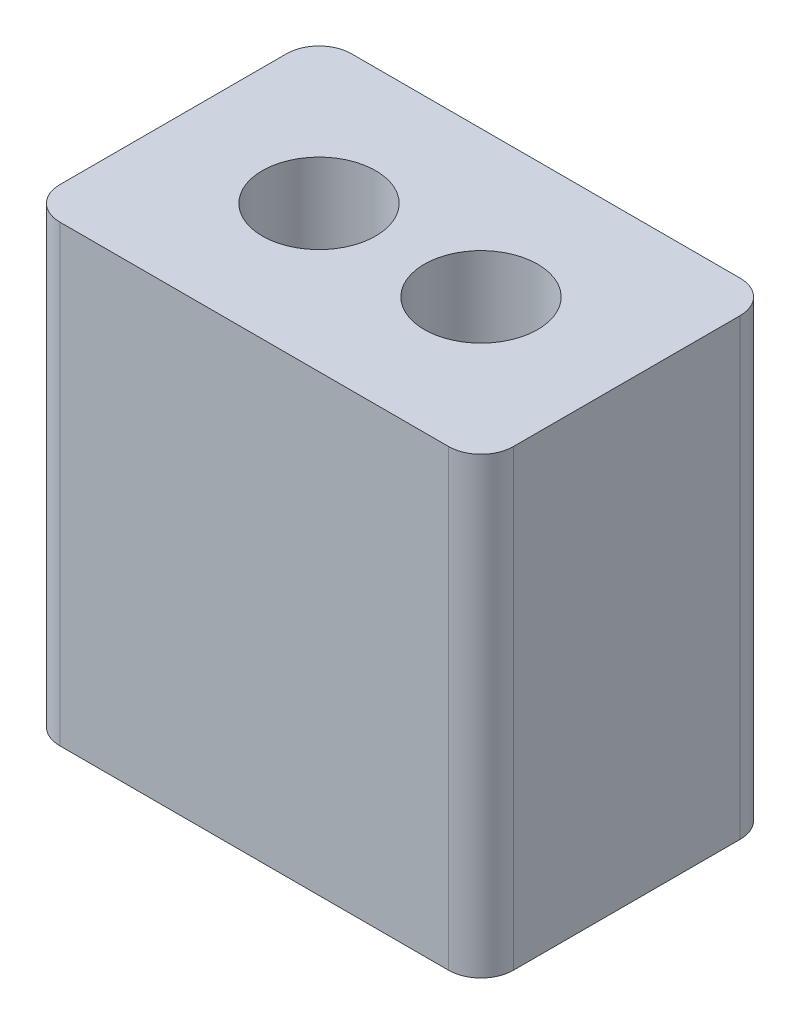
ISO-10303-21;
HEADER;
FILE_DESCRIPTION(('STEP AP214'),'2;1');
FILE_NAME('part.step','',(''),(''),'','','');
FILE_SCHEMA(('AUTOMOTIVE_DESIGN { 1 0 10303 214 1 1 1 1 }'));
ENDSEC;
DATA;
#1=APPLICATION_CONTEXT('core data for automotive mechanical design processes');
#2=APPLICATION_PROTOCOL_DEFINITION('international standard','automotive_design',2000,#1);
#3=PRODUCT_CONTEXT('',#1,'mechanical');
#4=PRODUCT('Part','Part','',(#3));
#5=PRODUCT_RELATED_PRODUCT_CATEGORY('part','',(#4));
#6=PRODUCT_DEFINITION_FORMATION('','',#4);
#7=PRODUCT_DEFINITION_CONTEXT('part definition',#1,'design');
#8=PRODUCT_DEFINITION('design','',#6,#7);
#9=PRODUCT_DEFINITION_SHAPE('','',#8);
#10=(LENGTH_UNIT() NAMED_UNIT(*) SI_UNIT(.MILLI.,.METRE.));
#11=(NAMED_UNIT(*) PLANE_ANGLE_UNIT() SI_UNIT($,.RADIAN.));
#12=(NAMED_UNIT(*) SI_UNIT($,.STERADIAN.) SOLID_ANGLE_UNIT());
#13=UNCERTAINTY_MEASURE_WITH_UNIT(LENGTH_MEASURE(1.E-05),#10,'distance_accuracy_value','');
#14=(GEOMETRIC_REPRESENTATION_CONTEXT(3) GLOBAL_UNCERTAINTY_ASSIGNED_CONTEXT((#13)) GLOBAL_UNIT_ASSIGNED_CONTEXT((#10,
#11,#12)) REPRESENTATION_CONTEXT('',''));
#15=CARTESIAN_POINT('',(0.,0.,0.));
#16=DIRECTION('',(0.,0.,1.));
#17=DIRECTION('',(1.,0.,0.));
#18=AXIS2_PLACEMENT_3D('',#15,#16,#17);
#19=CARTESIAN_POINT('',(7.,14.,-4.5));
#20=DIRECTION('',(-1.,0.,0.));
#21=DIRECTION('',(0.,0.,1.));
#22=AXIS2_PLACEMENT_3D('',#19,#20,#21);
#23=PLANE('',#22);
#24=DIRECTION('',(0.,0.,-1.));
#25=VECTOR('',#24,1.);
#26=CARTESIAN_POINT('',(7.,0.,-4.5));
#27=LINE('',#26,#25);
#28=CARTESIAN_POINT('',(7.,0.,3.5));
#29=VERTEX_POINT('',#28);
#30=CARTESIAN_POINT('',(7.,0.,-3.5));
#31=VERTEX_POINT('',#30);
#32=EDGE_CURVE('E130',#29,#31,#27,.T.);
#33=ORIENTED_EDGE('',*,*,#32,.T.);
#34=DIRECTION('',(0.,-1.,0.));
#35=VECTOR('',#34,1.);
#36=CARTESIAN_POINT('',(7.,14.,-3.5));
#37=LINE('',#36,#35);
#38=CARTESIAN_POINT('',(7.,14.,-3.5));
#39=VERTEX_POINT('',#38);
#40=EDGE_CURVE('E153',#31,#39,#37,.F.);
#41=ORIENTED_EDGE('',*,*,#40,.T.);
#42=DIRECTION('',(0.,0.,-1.));
#43=VECTOR('',#42,1.);
#44=CARTESIAN_POINT('',(7.,14.,-4.5));
#45=LINE('',#44,#43);
#46=CARTESIAN_POINT('',(7.,14.,3.5));
#47=VERTEX_POINT('',#46);
#48=EDGE_CURVE('E128',#47,#39,#45,.T.);
#49=ORIENTED_EDGE('',*,*,#48,.F.);
#50=DIRECTION('',(0.,-1.,0.));
#51=VECTOR('',#50,1.);
#52=CARTESIAN_POINT('',(7.,14.,3.5));
#53=LINE('',#52,#51);
#54=EDGE_CURVE('E150',#47,#29,#53,.T.);
#55=ORIENTED_EDGE('',*,*,#54,.T.);
#56=EDGE_LOOP('',(#33,#41,#49,#55));
#57=FACE_BOUND('',#56,.T.);
#58=ADVANCED_FACE('F35',(#57),#23,.F.);
#59=CARTESIAN_POINT('',(-7.,14.,-4.5));
#60=DIRECTION('',(0.,0.,1.));
#61=DIRECTION('',(1.,0.,0.));
#62=AXIS2_PLACEMENT_3D('',#59,#60,#61);
#63=PLANE('',#62);
#64=DIRECTION('',(-1.,0.,0.));
#65=VECTOR('',#64,1.);
#66=CARTESIAN_POINT('',(-7.,0.,-4.5));
#67=LINE('',#66,#65);
#68=CARTESIAN_POINT('',(6.,0.,-4.5));
#69=VERTEX_POINT('',#68);
#70=CARTESIAN_POINT('',(-6.,0.,-4.5));
#71=VERTEX_POINT('',#70);
#72=EDGE_CURVE('E126',#69,#71,#67,.T.);
#73=ORIENTED_EDGE('',*,*,#72,.T.);
#74=DIRECTION('',(0.,-1.,0.));
#75=VECTOR('',#74,1.);
#76=CARTESIAN_POINT('',(-6.,14.,-4.5));
#77=LINE('',#76,#75);
#78=CARTESIAN_POINT('',(-6.,14.,-4.5));
#79=VERTEX_POINT('',#78);
#80=EDGE_CURVE('E105',#71,#79,#77,.F.);
#81=ORIENTED_EDGE('',*,*,#80,.T.);
#82=DIRECTION('',(-1.,0.,0.));
#83=VECTOR('',#82,1.);
#84=CARTESIAN_POINT('',(-7.,14.,-4.5));
#85=LINE('',#84,#83);
#86=CARTESIAN_POINT('',(6.,14.,-4.5));
#87=VERTEX_POINT('',#86);
#88=EDGE_CURVE('E169',#87,#79,#85,.T.);
#89=ORIENTED_EDGE('',*,*,#88,.F.);
#90=DIRECTION('',(0.,-1.,0.));
#91=VECTOR('',#90,1.);
#92=CARTESIAN_POINT('',(6.,14.,-4.5));
#93=LINE('',#92,#91);
#94=EDGE_CURVE('E110',#87,#69,#93,.T.);
#95=ORIENTED_EDGE('',*,*,#94,.T.);
#96=EDGE_LOOP('',(#73,#81,#89,#95));
#97=FACE_BOUND('',#96,.T.);
#98=ADVANCED_FACE('F228',(#97),#63,.F.);
#99=CARTESIAN_POINT('',(-7.,14.,-4.5));
#100=DIRECTION('',(1.,0.,0.));
#101=DIRECTION('',(0.,0.,-1.));
#102=AXIS2_PLACEMENT_3D('',#99,#100,#101);
#103=PLANE('',#102);
#104=DIRECTION('',(0.,0.,1.));
#105=VECTOR('',#104,1.);
#106=CARTESIAN_POINT('',(-7.,14.,-4.5));
#107=LINE('',#106,#105);
#108=CARTESIAN_POINT('',(-7.,14.,-3.5));
#109=VERTEX_POINT('',#108);
#110=CARTESIAN_POINT('',(-7.,14.,3.5));
#111=VERTEX_POINT('',#110);
#112=EDGE_CURVE('E119',#109,#111,#107,.T.);
#113=ORIENTED_EDGE('',*,*,#112,.F.);
#114=DIRECTION('',(0.,-1.,0.));
#115=VECTOR('',#114,1.);
#116=CARTESIAN_POINT('',(-7.,14.,-3.5));
#117=LINE('',#116,#115);
#118=CARTESIAN_POINT('',(-7.,0.,-3.5));
#119=VERTEX_POINT('',#118);
#120=EDGE_CURVE('E104',#109,#119,#117,.T.);
#121=ORIENTED_EDGE('',*,*,#120,.T.);
#122=DIRECTION('',(0.,0.,1.));
#123=VECTOR('',#122,1.);
#124=CARTESIAN_POINT('',(-7.,0.,-4.5));
#125=LINE('',#124,#123);
#126=CARTESIAN_POINT('',(-7.,0.,3.5));
#127=VERTEX_POINT('',#126);
#128=EDGE_CURVE('E117',#119,#127,#125,.T.);
#129=ORIENTED_EDGE('',*,*,#128,.T.);
#130=DIRECTION('',(0.,-1.,0.));
#131=VECTOR('',#130,1.);
#132=CARTESIAN_POINT('',(-7.,14.,3.5));
#133=LINE('',#132,#131);
#134=EDGE_CURVE('E121',#127,#111,#133,.F.);
#135=ORIENTED_EDGE('',*,*,#134,.T.);
#136=EDGE_LOOP('',(#113,#121,#129,#135));
#137=FACE_BOUND('',#136,.T.);
#138=ADVANCED_FACE('F116',(#137),#103,.F.);
#139=CARTESIAN_POINT('',(-7.,14.,4.5));
#140=DIRECTION('',(0.,0.,-1.));
#141=DIRECTION('',(-1.,0.,0.));
#142=AXIS2_PLACEMENT_3D('',#139,#140,#141);
#143=PLANE('',#142);
#144=DIRECTION('',(1.,0.,0.));
#145=VECTOR('',#144,1.);
#146=CARTESIAN_POINT('',(-7.,0.,4.5));
#147=LINE('',#146,#145);
#148=CARTESIAN_POINT('',(-6.,0.,4.5));
#149=VERTEX_POINT('',#148);
#150=CARTESIAN_POINT('',(6.,0.,4.5));
#151=VERTEX_POINT('',#150);
#152=EDGE_CURVE('E125',#149,#151,#147,.T.);
#153=ORIENTED_EDGE('',*,*,#152,.T.);
#154=DIRECTION('',(0.,-1.,0.));
#155=VECTOR('',#154,1.);
#156=CARTESIAN_POINT('',(6.,14.,4.5));
#157=LINE('',#156,#155);
#158=CARTESIAN_POINT('',(6.,14.,4.5));
#159=VERTEX_POINT('',#158);
#160=EDGE_CURVE('E11',#151,#159,#157,.F.);
#161=ORIENTED_EDGE('',*,*,#160,.T.);
#162=DIRECTION('',(1.,0.,0.));
#163=VECTOR('',#162,1.);
#164=CARTESIAN_POINT('',(-7.,14.,4.5));
#165=LINE('',#164,#163);
#166=CARTESIAN_POINT('',(-6.,14.,4.5));
#167=VERTEX_POINT('',#166);
#168=EDGE_CURVE('E134',#167,#159,#165,.T.);
#169=ORIENTED_EDGE('',*,*,#168,.F.);
#170=DIRECTION('',(0.,-1.,0.));
#171=VECTOR('',#170,1.);
#172=CARTESIAN_POINT('',(-6.,14.,4.5));
#173=LINE('',#172,#171);
#174=EDGE_CURVE('E43',#167,#149,#173,.T.);
#175=ORIENTED_EDGE('',*,*,#174,.T.);
#176=EDGE_LOOP('',(#153,#161,#169,#175));
#177=FACE_BOUND('',#176,.T.);
#178=ADVANCED_FACE('F156',(#177),#143,.F.);
#179=CARTESIAN_POINT('',(0.,14.,0.));
#180=DIRECTION('',(0.,1.,0.));
#181=DIRECTION('',(0.,0.,1.));
#182=AXIS2_PLACEMENT_3D('',#179,#180,#181);
#183=PLANE('',#182);
#184=CARTESIAN_POINT('',(2.5,14.,0.));
#185=DIRECTION('',(0.,1.,0.));
#186=DIRECTION('',(0.,0.,-1.));
#187=AXIS2_PLACEMENT_3D('',#184,#185,#186);
#188=CIRCLE('',#187,1.75);
#189=CARTESIAN_POINT('',(2.5,14.,-1.75));
#190=VERTEX_POINT('',#189);
#191=EDGE_CURVE('E185',#190,#190,#188,.T.);
#192=ORIENTED_EDGE('',*,*,#191,.F.);
#193=EDGE_LOOP('',(#192));
#194=FACE_BOUND('',#193,.T.);
#195=CARTESIAN_POINT('',(-2.5,14.,0.));
#196=DIRECTION('',(0.,1.,0.));
#197=DIRECTION('',(0.,0.,1.));
#198=AXIS2_PLACEMENT_3D('',#195,#196,#197);
#199=CIRCLE('',#198,1.75);
#200=CARTESIAN_POINT('',(-2.5,14.,1.75));
#201=VERTEX_POINT('',#200);
#202=EDGE_CURVE('E174',#201,#201,#199,.T.);
#203=ORIENTED_EDGE('',*,*,#202,.F.);
#204=EDGE_LOOP('',(#203));
#205=FACE_BOUND('',#204,.T.);
#206=ORIENTED_EDGE('',*,*,#88,.T.);
#207=CARTESIAN_POINT('',(-6.,14.,-3.5));
#208=DIRECTION('',(0.,1.,0.));
#209=DIRECTION('',(0.,0.,1.));
#210=AXIS2_PLACEMENT_3D('',#207,#208,#209);
#211=CIRCLE('',#210,1.);
#212=EDGE_CURVE('E148',#79,#109,#211,.T.);
#213=ORIENTED_EDGE('',*,*,#212,.T.);
#214=ORIENTED_EDGE('',*,*,#112,.T.);
#215=CARTESIAN_POINT('',(-6.,14.,3.5));
#216=DIRECTION('',(0.,1.,0.));
#217=DIRECTION('',(0.,0.,1.));
#218=AXIS2_PLACEMENT_3D('',#215,#216,#217);
#219=CIRCLE('',#218,1.);
#220=EDGE_CURVE('E55',#111,#167,#219,.T.);
#221=ORIENTED_EDGE('',*,*,#220,.T.);
#222=ORIENTED_EDGE('',*,*,#168,.T.);
#223=CARTESIAN_POINT('',(6.,14.,3.5));
#224=DIRECTION('',(0.,1.,0.));
#225=DIRECTION('',(0.,0.,1.));
#226=AXIS2_PLACEMENT_3D('',#223,#224,#225);
#227=CIRCLE('',#226,1.);
#228=EDGE_CURVE('E144',#159,#47,#227,.T.);
#229=ORIENTED_EDGE('',*,*,#228,.T.);
#230=ORIENTED_EDGE('',*,*,#48,.T.);
#231=CARTESIAN_POINT('',(6.,14.,-3.5));
#232=DIRECTION('',(0.,1.,0.));
#233=DIRECTION('',(0.,0.,1.));
#234=AXIS2_PLACEMENT_3D('',#231,#232,#233);
#235=CIRCLE('',#234,1.);
#236=EDGE_CURVE('E146',#39,#87,#235,.T.);
#237=ORIENTED_EDGE('',*,*,#236,.T.);
#238=EDGE_LOOP('',(#206,#213,#214,#221,#222,#229,#230,#237));
#239=FACE_BOUND('',#238,.T.);
#240=ADVANCED_FACE('F220',(#194,#205,#239),#183,.T.);
#241=CARTESIAN_POINT('',(0.,0.,0.));
#242=DIRECTION('',(0.,1.,0.));
#243=DIRECTION('',(0.,0.,1.));
#244=AXIS2_PLACEMENT_3D('',#241,#242,#243);
#245=PLANE('',#244);
#246=CARTESIAN_POINT('',(2.5,0.,0.));
#247=DIRECTION('',(0.,1.,0.));
#248=DIRECTION('',(0.,0.,1.));
#249=AXIS2_PLACEMENT_3D('',#246,#247,#248);
#250=CIRCLE('',#249,0.95);
#251=CARTESIAN_POINT('',(2.5,0.,0.950000000000001));
#252=VERTEX_POINT('',#251);
#253=EDGE_CURVE('E196',#252,#252,#250,.F.);
#254=ORIENTED_EDGE('',*,*,#253,.F.);
#255=EDGE_LOOP('',(#254));
#256=FACE_BOUND('',#255,.T.);
#257=CARTESIAN_POINT('',(-2.5,0.,0.));
#258=DIRECTION('',(0.,1.,0.));
#259=DIRECTION('',(0.,0.,1.));
#260=AXIS2_PLACEMENT_3D('',#257,#258,#259);
#261=CIRCLE('',#260,0.95);
#262=CARTESIAN_POINT('',(-2.5,0.,0.95));
#263=VERTEX_POINT('',#262);
#264=EDGE_CURVE('E188',#263,#263,#261,.F.);
#265=ORIENTED_EDGE('',*,*,#264,.F.);
#266=EDGE_LOOP('',(#265));
#267=FACE_BOUND('',#266,.T.);
#268=ORIENTED_EDGE('',*,*,#128,.F.);
#269=CARTESIAN_POINT('',(-6.,0.,-3.5));
#270=DIRECTION('',(0.,1.,0.));
#271=DIRECTION('',(0.,0.,1.));
#272=AXIS2_PLACEMENT_3D('',#269,#270,#271);
#273=CIRCLE('',#272,1.);
#274=EDGE_CURVE('E100',#119,#71,#273,.F.);
#275=ORIENTED_EDGE('',*,*,#274,.T.);
#276=ORIENTED_EDGE('',*,*,#72,.F.);
#277=CARTESIAN_POINT('',(6.,0.,-3.5));
#278=DIRECTION('',(0.,1.,0.));
#279=DIRECTION('',(0.,0.,1.));
#280=AXIS2_PLACEMENT_3D('',#277,#278,#279);
#281=CIRCLE('',#280,1.);
#282=EDGE_CURVE('E111',#69,#31,#281,.F.);
#283=ORIENTED_EDGE('',*,*,#282,.T.);
#284=ORIENTED_EDGE('',*,*,#32,.F.);
#285=CARTESIAN_POINT('',(6.,0.,3.5));
#286=DIRECTION('',(0.,1.,0.));
#287=DIRECTION('',(0.,0.,1.));
#288=AXIS2_PLACEMENT_3D('',#285,#286,#287);
#289=CIRCLE('',#288,1.);
#290=EDGE_CURVE('E137',#29,#151,#289,.F.);
#291=ORIENTED_EDGE('',*,*,#290,.T.);
#292=ORIENTED_EDGE('',*,*,#152,.F.);
#293=CARTESIAN_POINT('',(-6.,0.,3.5));
#294=DIRECTION('',(0.,1.,0.));
#295=DIRECTION('',(0.,0.,1.));
#296=AXIS2_PLACEMENT_3D('',#293,#294,#295);
#297=CIRCLE('',#296,1.);
#298=EDGE_CURVE('E120',#149,#127,#297,.F.);
#299=ORIENTED_EDGE('',*,*,#298,.T.);
#300=EDGE_LOOP('',(#268,#275,#276,#283,#284,#291,#292,#299));
#301=FACE_BOUND('',#300,.T.);
#302=ADVANCED_FACE('F123',(#256,#267,#301),#245,.F.);
#303=CARTESIAN_POINT('',(-6.,14.,-3.5));
#304=DIRECTION('',(0.,-1.,0.));
#305=DIRECTION('',(0.,0.,-1.));
#306=AXIS2_PLACEMENT_3D('',#303,#304,#305);
#307=CYLINDRICAL_SURFACE('',#306,1.);
#308=ORIENTED_EDGE('',*,*,#212,.F.);
#309=ORIENTED_EDGE('',*,*,#80,.F.);
#310=ORIENTED_EDGE('',*,*,#274,.F.);
#311=ORIENTED_EDGE('',*,*,#120,.F.);
#312=EDGE_LOOP('',(#308,#309,#310,#311));
#313=FACE_BOUND('',#312,.T.);
#314=ADVANCED_FACE('F103',(#313),#307,.T.);
#315=CARTESIAN_POINT('',(6.,14.,-3.5));
#316=DIRECTION('',(0.,-1.,0.));
#317=DIRECTION('',(0.,0.,-1.));
#318=AXIS2_PLACEMENT_3D('',#315,#316,#317);
#319=CYLINDRICAL_SURFACE('',#318,1.);
#320=ORIENTED_EDGE('',*,*,#236,.F.);
#321=ORIENTED_EDGE('',*,*,#40,.F.);
#322=ORIENTED_EDGE('',*,*,#282,.F.);
#323=ORIENTED_EDGE('',*,*,#94,.F.);
#324=EDGE_LOOP('',(#320,#321,#322,#323));
#325=FACE_BOUND('',#324,.T.);
#326=ADVANCED_FACE('F230',(#325),#319,.T.);
#327=CARTESIAN_POINT('',(6.,14.,3.5));
#328=DIRECTION('',(0.,-1.,0.));
#329=DIRECTION('',(0.,0.,-1.));
#330=AXIS2_PLACEMENT_3D('',#327,#328,#329);
#331=CYLINDRICAL_SURFACE('',#330,1.);
#332=ORIENTED_EDGE('',*,*,#228,.F.);
#333=ORIENTED_EDGE('',*,*,#160,.F.);
#334=ORIENTED_EDGE('',*,*,#290,.F.);
#335=ORIENTED_EDGE('',*,*,#54,.F.);
#336=EDGE_LOOP('',(#332,#333,#334,#335));
#337=FACE_BOUND('',#336,.T.);
#338=ADVANCED_FACE('F163',(#337),#331,.T.);
#339=CARTESIAN_POINT('',(-6.,14.,3.5));
#340=DIRECTION('',(0.,-1.,0.));
#341=DIRECTION('',(0.,0.,-1.));
#342=AXIS2_PLACEMENT_3D('',#339,#340,#341);
#343=CYLINDRICAL_SURFACE('',#342,1.);
#344=ORIENTED_EDGE('',*,*,#220,.F.);
#345=ORIENTED_EDGE('',*,*,#134,.F.);
#346=ORIENTED_EDGE('',*,*,#298,.F.);
#347=ORIENTED_EDGE('',*,*,#174,.F.);
#348=EDGE_LOOP('',(#344,#345,#346,#347));
#349=FACE_BOUND('',#348,.T.);
#350=ADVANCED_FACE('F37',(#349),#343,.T.);
#351=CARTESIAN_POINT('',(-2.5,7.,0.));
#352=DIRECTION('',(0.,1.,0.));
#353=DIRECTION('',(0.,0.,1.));
#354=AXIS2_PLACEMENT_3D('',#351,#352,#353);
#355=CYLINDRICAL_SURFACE('',#354,1.75);
#356=CARTESIAN_POINT('',(-2.5,7.,0.));
#357=DIRECTION('',(0.,1.,0.));
#358=DIRECTION('',(0.,0.,1.));
#359=AXIS2_PLACEMENT_3D('',#356,#357,#358);
#360=CIRCLE('',#359,1.75);
#361=CARTESIAN_POINT('',(-2.5,7.,1.75));
#362=VERTEX_POINT('',#361);
#363=EDGE_CURVE('E178',#362,#362,#360,.T.);
#364=ORIENTED_EDGE('',*,*,#363,.F.);
#365=EDGE_LOOP('',(#364));
#366=FACE_BOUND('',#365,.T.);
#367=ORIENTED_EDGE('',*,*,#202,.T.);
#368=EDGE_LOOP('',(#367));
#369=FACE_BOUND('',#368,.T.);
#370=ADVANCED_FACE('F252',(#366,#369),#355,.F.);
#371=CARTESIAN_POINT('',(-2.5,7.,0.));
#372=DIRECTION('',(0.,1.,0.));
#373=DIRECTION('',(0.,0.,1.));
#374=AXIS2_PLACEMENT_3D('',#371,#372,#373);
#375=PLANE('',#374);
#376=CARTESIAN_POINT('',(-2.5,7.,0.));
#377=DIRECTION('',(0.,1.,0.));
#378=DIRECTION('',(0.,0.,1.));
#379=AXIS2_PLACEMENT_3D('',#376,#377,#378);
#380=CIRCLE('',#379,0.95);
#381=CARTESIAN_POINT('',(-2.5,7.,0.95));
#382=VERTEX_POINT('',#381);
#383=EDGE_CURVE('E193',#382,#382,#380,.T.);
#384=ORIENTED_EDGE('',*,*,#383,.F.);
#385=EDGE_LOOP('',(#384));
#386=FACE_BOUND('',#385,.T.);
#387=ORIENTED_EDGE('',*,*,#363,.T.);
#388=EDGE_LOOP('',(#387));
#389=FACE_BOUND('',#388,.T.);
#390=ADVANCED_FACE('F216',(#386,#389),#375,.T.);
#391=CARTESIAN_POINT('',(2.5,7.,0.));
#392=DIRECTION('',(0.,1.,0.));
#393=DIRECTION('',(0.,0.,1.));
#394=AXIS2_PLACEMENT_3D('',#391,#392,#393);
#395=CYLINDRICAL_SURFACE('',#394,1.75);
#396=CARTESIAN_POINT('',(2.5,7.,0.));
#397=DIRECTION('',(0.,1.,0.));
#398=DIRECTION('',(0.,0.,-1.));
#399=AXIS2_PLACEMENT_3D('',#396,#397,#398);
#400=CIRCLE('',#399,1.75);
#401=CARTESIAN_POINT('',(2.5,7.,-1.75));
#402=VERTEX_POINT('',#401);
#403=EDGE_CURVE('E183',#402,#402,#400,.T.);
#404=ORIENTED_EDGE('',*,*,#403,.F.);
#405=EDGE_LOOP('',(#404));
#406=FACE_BOUND('',#405,.T.);
#407=ORIENTED_EDGE('',*,*,#191,.T.);
#408=EDGE_LOOP('',(#407));
#409=FACE_BOUND('',#408,.T.);
#410=ADVANCED_FACE('F210',(#406,#409),#395,.F.);
#411=CARTESIAN_POINT('',(2.5,7.,0.));
#412=DIRECTION('',(0.,-1.,0.));
#413=DIRECTION('',(0.,0.,-1.));
#414=AXIS2_PLACEMENT_3D('',#411,#412,#413);
#415=PLANE('',#414);
#416=CARTESIAN_POINT('',(2.5,7.,0.));
#417=DIRECTION('',(0.,1.,0.));
#418=DIRECTION('',(0.,0.,1.));
#419=AXIS2_PLACEMENT_3D('',#416,#417,#418);
#420=CIRCLE('',#419,0.95);
#421=CARTESIAN_POINT('',(2.5,7.,0.950000000000001));
#422=VERTEX_POINT('',#421);
#423=EDGE_CURVE('E199',#422,#422,#420,.T.);
#424=ORIENTED_EDGE('',*,*,#423,.F.);
#425=EDGE_LOOP('',(#424));
#426=FACE_BOUND('',#425,.T.);
#427=ORIENTED_EDGE('',*,*,#403,.T.);
#428=EDGE_LOOP('',(#427));
#429=FACE_BOUND('',#428,.T.);
#430=ADVANCED_FACE('F206',(#426,#429),#415,.F.);
#431=CARTESIAN_POINT('',(-2.5,-0.00100000000000013,0.));
#432=DIRECTION('',(0.,1.,0.));
#433=DIRECTION('',(0.,0.,1.));
#434=AXIS2_PLACEMENT_3D('',#431,#432,#433);
#435=CYLINDRICAL_SURFACE('',#434,0.95);
#436=ORIENTED_EDGE('',*,*,#383,.T.);
#437=EDGE_LOOP('',(#436));
#438=FACE_BOUND('',#437,.T.);
#439=ORIENTED_EDGE('',*,*,#264,.T.);
#440=EDGE_LOOP('',(#439));
#441=FACE_BOUND('',#440,.T.);
#442=ADVANCED_FACE('F209',(#438,#441),#435,.F.);
#443=CARTESIAN_POINT('',(2.5,-0.00100000000000013,0.));
#444=DIRECTION('',(0.,1.,0.));
#445=DIRECTION('',(0.,0.,1.));
#446=AXIS2_PLACEMENT_3D('',#443,#444,#445);
#447=CYLINDRICAL_SURFACE('',#446,0.95);
#448=ORIENTED_EDGE('',*,*,#423,.T.);
#449=EDGE_LOOP('',(#448));
#450=FACE_BOUND('',#449,.T.);
#451=ORIENTED_EDGE('',*,*,#253,.T.);
#452=EDGE_LOOP('',(#451));
#453=FACE_BOUND('',#452,.T.);
#454=ADVANCED_FACE('F203',(#450,#453),#447,.F.);
#455=CLOSED_SHELL('',(#58,#98,#138,#178,#240,#302,#314,#326,#338,#350,#370,#390,#410,#430,#442,#454));
#456=MANIFOLD_SOLID_BREP('B2',#455);
#457=ADVANCED_BREP_SHAPE_REPRESENTATION('',(#18,#456),#14);
#458=SHAPE_DEFINITION_REPRESENTATION(#9,#457);
ENDSEC;
END-ISO-10303-21;
